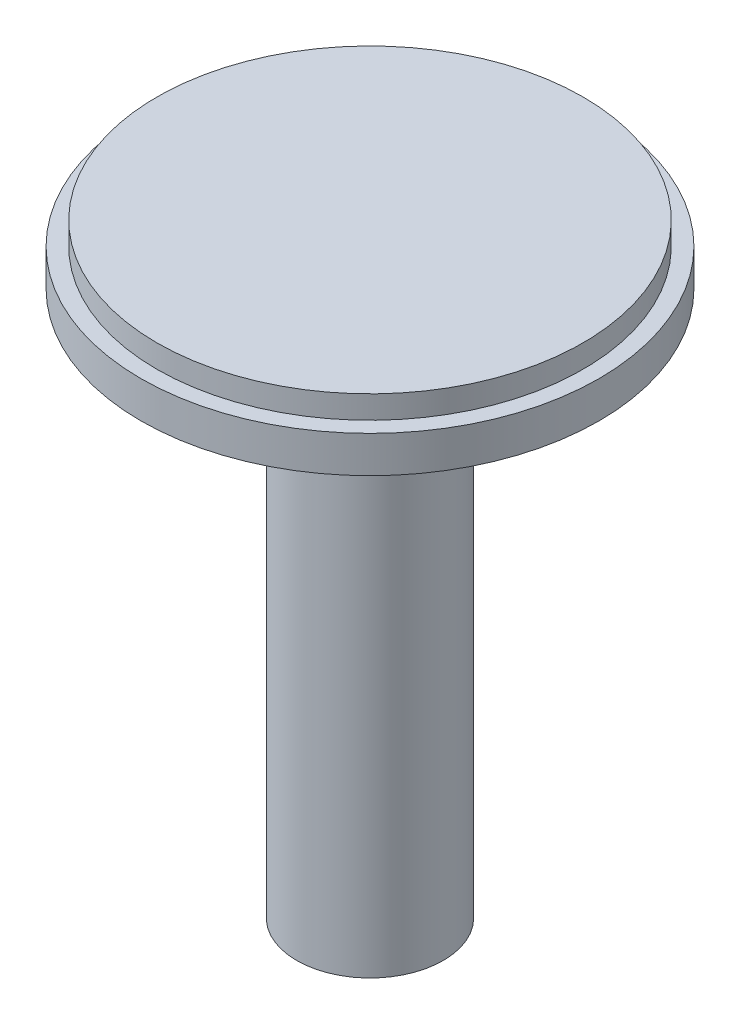
ISO-10303-21;
HEADER;
FILE_DESCRIPTION(('STEP AP214'),'2;1');
FILE_NAME('part.step','',(''),(''),'','','');
FILE_SCHEMA(('AUTOMOTIVE_DESIGN { 1 0 10303 214 1 1 1 1 }'));
ENDSEC;
DATA;
#1=APPLICATION_CONTEXT('core data for automotive mechanical design processes');
#2=APPLICATION_PROTOCOL_DEFINITION('international standard','automotive_design',2000,#1);
#3=PRODUCT_CONTEXT('',#1,'mechanical');
#4=PRODUCT('Part','Part','',(#3));
#5=PRODUCT_RELATED_PRODUCT_CATEGORY('part','',(#4));
#6=PRODUCT_DEFINITION_FORMATION('','',#4);
#7=PRODUCT_DEFINITION_CONTEXT('part definition',#1,'design');
#8=PRODUCT_DEFINITION('design','',#6,#7);
#9=PRODUCT_DEFINITION_SHAPE('','',#8);
#10=(LENGTH_UNIT() NAMED_UNIT(*) SI_UNIT(.MILLI.,.METRE.));
#11=(NAMED_UNIT(*) PLANE_ANGLE_UNIT() SI_UNIT($,.RADIAN.));
#12=(NAMED_UNIT(*) SI_UNIT($,.STERADIAN.) SOLID_ANGLE_UNIT());
#13=UNCERTAINTY_MEASURE_WITH_UNIT(LENGTH_MEASURE(1.E-05),#10,'distance_accuracy_value','');
#14=(GEOMETRIC_REPRESENTATION_CONTEXT(3) GLOBAL_UNCERTAINTY_ASSIGNED_CONTEXT((#13)) GLOBAL_UNIT_ASSIGNED_CONTEXT((#10,
#11,#12)) REPRESENTATION_CONTEXT('',''));
#15=CARTESIAN_POINT('',(0.,0.,0.));
#16=DIRECTION('',(0.,0.,1.));
#17=DIRECTION('',(1.,0.,0.));
#18=AXIS2_PLACEMENT_3D('',#15,#16,#17);
#19=CARTESIAN_POINT('',(0.,119.,0.));
#20=DIRECTION('',(0.,-1.,0.));
#21=DIRECTION('',(0.,0.,-1.));
#22=AXIS2_PLACEMENT_3D('',#19,#20,#21);
#23=CYLINDRICAL_SURFACE('',#22,16.);
#24=CARTESIAN_POINT('',(0.,119.,0.));
#25=DIRECTION('',(0.,1.,0.));
#26=DIRECTION('',(0.,0.,1.));
#27=AXIS2_PLACEMENT_3D('',#24,#25,#26);
#28=CIRCLE('',#27,16.);
#29=CARTESIAN_POINT('',(0.,119.,16.));
#30=VERTEX_POINT('',#29);
#31=EDGE_CURVE('E42',#30,#30,#28,.T.);
#32=ORIENTED_EDGE('',*,*,#31,.F.);
#33=EDGE_LOOP('',(#32));
#34=FACE_BOUND('',#33,.T.);
#35=CARTESIAN_POINT('',(0.,0.,0.));
#36=DIRECTION('',(0.,1.,0.));
#37=DIRECTION('',(0.,0.,1.));
#38=AXIS2_PLACEMENT_3D('',#35,#36,#37);
#39=CIRCLE('',#38,16.);
#40=CARTESIAN_POINT('',(0.,0.,16.));
#41=VERTEX_POINT('',#40);
#42=EDGE_CURVE('E38',#41,#41,#39,.T.);
#43=ORIENTED_EDGE('',*,*,#42,.T.);
#44=EDGE_LOOP('',(#43));
#45=FACE_BOUND('',#44,.T.);
#46=ADVANCED_FACE('F35',(#34,#45),#23,.T.);
#47=CARTESIAN_POINT('',(0.,0.,0.));
#48=DIRECTION('',(0.,1.,0.));
#49=DIRECTION('',(0.,0.,1.));
#50=AXIS2_PLACEMENT_3D('',#47,#48,#49);
#51=PLANE('',#50);
#52=ORIENTED_EDGE('',*,*,#42,.F.);
#53=EDGE_LOOP('',(#52));
#54=FACE_BOUND('',#53,.T.);
#55=ADVANCED_FACE('F76',(#54),#51,.F.);
#56=CARTESIAN_POINT('',(0.,127.,0.));
#57=DIRECTION('',(0.,-1.,0.));
#58=DIRECTION('',(0.,0.,-1.));
#59=AXIS2_PLACEMENT_3D('',#56,#57,#58);
#60=CYLINDRICAL_SURFACE('',#59,50.);
#61=CARTESIAN_POINT('',(0.,127.,0.));
#62=DIRECTION('',(0.,1.,0.));
#63=DIRECTION('',(0.,0.,1.));
#64=AXIS2_PLACEMENT_3D('',#61,#62,#63);
#65=CIRCLE('',#64,50.);
#66=CARTESIAN_POINT('',(0.,127.,50.));
#67=VERTEX_POINT('',#66);
#68=EDGE_CURVE('E50',#67,#67,#65,.T.);
#69=ORIENTED_EDGE('',*,*,#68,.F.);
#70=EDGE_LOOP('',(#69));
#71=FACE_BOUND('',#70,.T.);
#72=CARTESIAN_POINT('',(0.,119.,0.));
#73=DIRECTION('',(0.,1.,0.));
#74=DIRECTION('',(0.,0.,1.));
#75=AXIS2_PLACEMENT_3D('',#72,#73,#74);
#76=CIRCLE('',#75,50.);
#77=CARTESIAN_POINT('',(0.,119.,50.));
#78=VERTEX_POINT('',#77);
#79=EDGE_CURVE('E53',#78,#78,#76,.T.);
#80=ORIENTED_EDGE('',*,*,#79,.T.);
#81=EDGE_LOOP('',(#80));
#82=FACE_BOUND('',#81,.T.);
#83=ADVANCED_FACE('F81',(#71,#82),#60,.T.);
#84=CARTESIAN_POINT('',(0.,127.,0.));
#85=DIRECTION('',(0.,1.,0.));
#86=DIRECTION('',(0.,0.,1.));
#87=AXIS2_PLACEMENT_3D('',#84,#85,#86);
#88=PLANE('',#87);
#89=CARTESIAN_POINT('',(0.,127.,0.));
#90=DIRECTION('',(0.,1.,0.));
#91=DIRECTION('',(0.,0.,1.));
#92=AXIS2_PLACEMENT_3D('',#89,#90,#91);
#93=CIRCLE('',#92,46.5);
#94=CARTESIAN_POINT('',(0.,127.,46.5));
#95=VERTEX_POINT('',#94);
#96=EDGE_CURVE('E10',#95,#95,#93,.T.);
#97=ORIENTED_EDGE('',*,*,#96,.F.);
#98=EDGE_LOOP('',(#97));
#99=FACE_BOUND('',#98,.T.);
#100=ORIENTED_EDGE('',*,*,#68,.T.);
#101=EDGE_LOOP('',(#100));
#102=FACE_BOUND('',#101,.T.);
#103=ADVANCED_FACE('F71',(#99,#102),#88,.T.);
#104=CARTESIAN_POINT('',(0.,119.,0.));
#105=DIRECTION('',(0.,1.,0.));
#106=DIRECTION('',(0.,0.,1.));
#107=AXIS2_PLACEMENT_3D('',#104,#105,#106);
#108=PLANE('',#107);
#109=ORIENTED_EDGE('',*,*,#31,.T.);
#110=EDGE_LOOP('',(#109));
#111=FACE_BOUND('',#110,.T.);
#112=ORIENTED_EDGE('',*,*,#79,.F.);
#113=EDGE_LOOP('',(#112));
#114=FACE_BOUND('',#113,.T.);
#115=ADVANCED_FACE('F64',(#111,#114),#108,.F.);
#116=CARTESIAN_POINT('',(0.,132.,0.));
#117=DIRECTION('',(0.,-1.,0.));
#118=DIRECTION('',(0.,0.,-1.));
#119=AXIS2_PLACEMENT_3D('',#116,#117,#118);
#120=CYLINDRICAL_SURFACE('',#119,46.5);
#121=CARTESIAN_POINT('',(0.,132.,0.));
#122=DIRECTION('',(0.,1.,0.));
#123=DIRECTION('',(0.,0.,1.));
#124=AXIS2_PLACEMENT_3D('',#121,#122,#123);
#125=CIRCLE('',#124,46.5);
#126=CARTESIAN_POINT('',(0.,132.,46.5));
#127=VERTEX_POINT('',#126);
#128=EDGE_CURVE('E49',#127,#127,#125,.T.);
#129=ORIENTED_EDGE('',*,*,#128,.F.);
#130=EDGE_LOOP('',(#129));
#131=FACE_BOUND('',#130,.T.);
#132=ORIENTED_EDGE('',*,*,#96,.T.);
#133=EDGE_LOOP('',(#132));
#134=FACE_BOUND('',#133,.T.);
#135=ADVANCED_FACE('F62',(#131,#134),#120,.T.);
#136=CARTESIAN_POINT('',(0.,132.,0.));
#137=DIRECTION('',(0.,1.,0.));
#138=DIRECTION('',(0.,0.,1.));
#139=AXIS2_PLACEMENT_3D('',#136,#137,#138);
#140=PLANE('',#139);
#141=ORIENTED_EDGE('',*,*,#128,.T.);
#142=EDGE_LOOP('',(#141));
#143=FACE_BOUND('',#142,.T.);
#144=ADVANCED_FACE('F60',(#143),#140,.T.);
#145=CLOSED_SHELL('',(#46,#55,#83,#103,#115,#135,#144));
#146=MANIFOLD_SOLID_BREP('B2',#145);
#147=ADVANCED_BREP_SHAPE_REPRESENTATION('',(#18,#146),#14);
#148=SHAPE_DEFINITION_REPRESENTATION(#9,#147);
ENDSEC;
END-ISO-10303-21;
